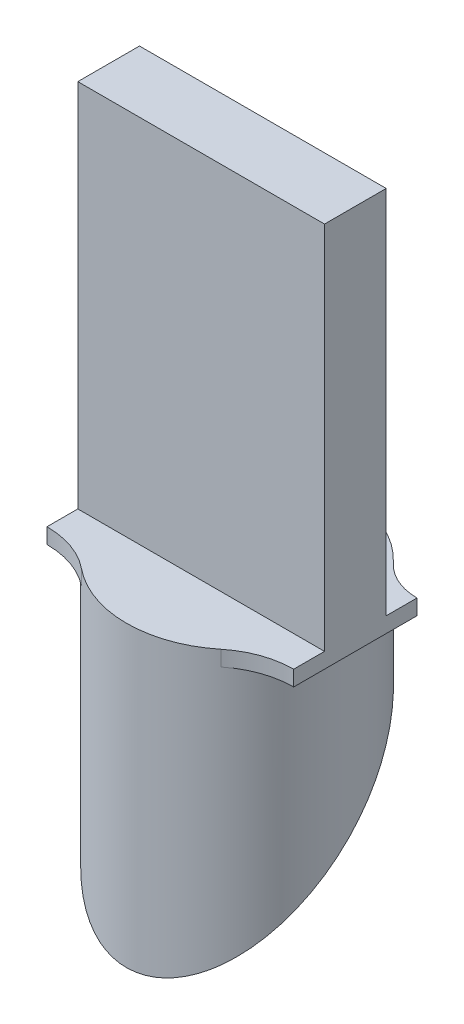
ISO-10303-21;
HEADER;
FILE_DESCRIPTION(('STEP AP214'),'2;1');
FILE_NAME('part.step','',(''),(''),'','','');
FILE_SCHEMA(('AUTOMOTIVE_DESIGN { 1 0 10303 214 1 1 1 1 }'));
ENDSEC;
DATA;
#1=APPLICATION_CONTEXT('core data for automotive mechanical design processes');
#2=APPLICATION_PROTOCOL_DEFINITION('international standard','automotive_design',2000,#1);
#3=PRODUCT_CONTEXT('',#1,'mechanical');
#4=PRODUCT('Part','Part','',(#3));
#5=PRODUCT_RELATED_PRODUCT_CATEGORY('part','',(#4));
#6=PRODUCT_DEFINITION_FORMATION('','',#4);
#7=PRODUCT_DEFINITION_CONTEXT('part definition',#1,'design');
#8=PRODUCT_DEFINITION('design','',#6,#7);
#9=PRODUCT_DEFINITION_SHAPE('','',#8);
#10=(LENGTH_UNIT() NAMED_UNIT(*) SI_UNIT(.MILLI.,.METRE.));
#11=(NAMED_UNIT(*) PLANE_ANGLE_UNIT() SI_UNIT($,.RADIAN.));
#12=(NAMED_UNIT(*) SI_UNIT($,.STERADIAN.) SOLID_ANGLE_UNIT());
#13=UNCERTAINTY_MEASURE_WITH_UNIT(LENGTH_MEASURE(1.E-05),#10,'distance_accuracy_value','');
#14=(GEOMETRIC_REPRESENTATION_CONTEXT(3) GLOBAL_UNCERTAINTY_ASSIGNED_CONTEXT((#13)) GLOBAL_UNIT_ASSIGNED_CONTEXT((#10,
#11,#12)) REPRESENTATION_CONTEXT('',''));
#15=CARTESIAN_POINT('',(0.,0.,0.));
#16=DIRECTION('',(0.,0.,1.));
#17=DIRECTION('',(1.,0.,0.));
#18=AXIS2_PLACEMENT_3D('',#15,#16,#17);
#19=CARTESIAN_POINT('',(-25.4,1055.89605122421,30.174126034576));
#20=DIRECTION('',(0.,-1.,0.));
#21=DIRECTION('',(0.,0.,-1.));
#22=AXIS2_PLACEMENT_3D('',#19,#20,#21);
#23=PLANE('',#22);
#24=DIRECTION('',(-1.,0.,0.));
#25=VECTOR('',#24,1.);
#26=CARTESIAN_POINT('',(25.4,1055.89605122421,-6.35));
#27=LINE('',#26,#25);
#28=CARTESIAN_POINT('',(25.4,1055.89605122421,-6.35));
#29=VERTEX_POINT('',#28);
#30=CARTESIAN_POINT('',(-25.4,1055.89605122421,-6.35));
#31=VERTEX_POINT('',#30);
#32=EDGE_CURVE('E142',#29,#31,#27,.T.);
#33=ORIENTED_EDGE('',*,*,#32,.F.);
#34=DIRECTION('',(0.,0.,-1.));
#35=VECTOR('',#34,1.);
#36=CARTESIAN_POINT('',(25.4,1055.89605122421,-12.7));
#37=LINE('',#36,#35);
#38=CARTESIAN_POINT('',(25.4,1055.89605122421,-12.7));
#39=VERTEX_POINT('',#38);
#40=EDGE_CURVE('E164',#29,#39,#37,.T.);
#41=ORIENTED_EDGE('',*,*,#40,.T.);
#42=CARTESIAN_POINT('',(25.4,1055.89605122421,-24.5179424418149));
#43=DIRECTION('',(0.,-1.,0.));
#44=DIRECTION('',(0.,0.,1.));
#45=AXIS2_PLACEMENT_3D('',#42,#43,#44);
#46=CIRCLE('',#45,11.8179424418149);
#47=CARTESIAN_POINT('',(16.7213120057109,1055.89605122421,-16.4964626372008));
#48=VERTEX_POINT('',#47);
#49=EDGE_CURVE('E167',#39,#48,#46,.T.);
#50=ORIENTED_EDGE('',*,*,#49,.T.);
#51=CARTESIAN_POINT('',(0.,1055.89605122421,-1.04140000000008));
#52=DIRECTION('',(0.,1.,0.));
#53=DIRECTION('',(0.,0.,1.));
#54=AXIS2_PLACEMENT_3D('',#51,#52,#53);
#55=CIRCLE('',#54,22.7697438789313);
#56=CARTESIAN_POINT('',(-16.7213120057109,1055.89605122421,-16.4964626372008));
#57=VERTEX_POINT('',#56);
#58=EDGE_CURVE('E169',#48,#57,#55,.T.);
#59=ORIENTED_EDGE('',*,*,#58,.T.);
#60=CARTESIAN_POINT('',(-25.4,1055.89605122421,-24.5179424418149));
#61=DIRECTION('',(0.,-1.,0.));
#62=DIRECTION('',(0.,0.,1.));
#63=AXIS2_PLACEMENT_3D('',#60,#61,#62);
#64=CIRCLE('',#63,11.8179424418149);
#65=CARTESIAN_POINT('',(-25.4,1055.89605122421,-12.7));
#66=VERTEX_POINT('',#65);
#67=EDGE_CURVE('E171',#57,#66,#64,.T.);
#68=ORIENTED_EDGE('',*,*,#67,.T.);
#69=DIRECTION('',(0.,0.,1.));
#70=VECTOR('',#69,1.);
#71=CARTESIAN_POINT('',(-25.4,1055.89605122421,-12.7));
#72=LINE('',#71,#70);
#73=EDGE_CURVE('E58',#66,#31,#72,.T.);
#74=ORIENTED_EDGE('',*,*,#73,.T.);
#75=EDGE_LOOP('',(#33,#41,#50,#59,#68,#74));
#76=FACE_BOUND('',#75,.T.);
#77=ADVANCED_FACE('F35',(#76),#23,.F.);
#78=DIRECTION('',(1.,0.,0.));
#79=VECTOR('',#78,1.);
#80=CARTESIAN_POINT('',(25.4,1055.89605122421,6.35));
#81=LINE('',#80,#79);
#82=CARTESIAN_POINT('',(-25.4,1055.89605122421,6.35));
#83=VERTEX_POINT('',#82);
#84=CARTESIAN_POINT('',(25.4,1055.89605122421,6.35));
#85=VERTEX_POINT('',#84);
#86=EDGE_CURVE('E50',#83,#85,#81,.T.);
#87=ORIENTED_EDGE('',*,*,#86,.F.);
#88=CARTESIAN_POINT('',(-25.4,1055.89605122421,12.7));
#89=VERTEX_POINT('',#88);
#90=EDGE_CURVE('E146',#83,#89,#72,.T.);
#91=ORIENTED_EDGE('',*,*,#90,.T.);
#92=CARTESIAN_POINT('',(-25.4,1055.89605122421,30.174126034576));
#93=DIRECTION('',(0.,-1.,0.));
#94=DIRECTION('',(0.,0.,-1.));
#95=AXIS2_PLACEMENT_3D('',#92,#93,#94);
#96=CIRCLE('',#95,17.474126034576);
#97=CARTESIAN_POINT('',(-14.3711699637201,1055.89605122421,16.6201602421189));
#98=VERTEX_POINT('',#97);
#99=EDGE_CURVE('E156',#89,#98,#96,.T.);
#100=ORIENTED_EDGE('',*,*,#99,.T.);
#101=CARTESIAN_POINT('',(0.,1055.89605122421,-1.04140000000008));
#102=DIRECTION('',(0.,1.,0.));
#103=DIRECTION('',(0.,0.,1.));
#104=AXIS2_PLACEMENT_3D('',#101,#102,#103);
#105=CIRCLE('',#104,22.7697438789313);
#106=CARTESIAN_POINT('',(14.3711699637201,1055.89605122421,16.6201602421189));
#107=VERTEX_POINT('',#106);
#108=EDGE_CURVE('E159',#98,#107,#105,.T.);
#109=ORIENTED_EDGE('',*,*,#108,.T.);
#110=CARTESIAN_POINT('',(25.4,1055.89605122421,30.174126034576));
#111=DIRECTION('',(0.,-1.,0.));
#112=DIRECTION('',(0.,0.,1.));
#113=AXIS2_PLACEMENT_3D('',#110,#111,#112);
#114=CIRCLE('',#113,17.474126034576);
#115=CARTESIAN_POINT('',(25.4,1055.89605122421,12.7));
#116=VERTEX_POINT('',#115);
#117=EDGE_CURVE('E162',#107,#116,#114,.T.);
#118=ORIENTED_EDGE('',*,*,#117,.T.);
#119=EDGE_CURVE('E165',#116,#85,#37,.T.);
#120=ORIENTED_EDGE('',*,*,#119,.T.);
#121=EDGE_LOOP('',(#87,#91,#100,#109,#118,#120));
#122=FACE_BOUND('',#121,.T.);
#123=ADVANCED_FACE('F249',(#122),#23,.F.);
#124=CARTESIAN_POINT('',(0.,1052.72105122421,-1.04140000000008));
#125=DIRECTION('',(0.,1.,0.));
#126=DIRECTION('',(0.,0.,1.));
#127=AXIS2_PLACEMENT_3D('',#124,#125,#126);
#128=CYLINDRICAL_SURFACE('',#127,22.7697438789313);
#129=CARTESIAN_POINT('',(0.,1017.25130734528,-1.04140000000008));
#130=DIRECTION('',(0.,0.707106781186554,0.707106781186541));
#131=DIRECTION('',(0.,0.707106781186541,-0.707106781186554));
#132=AXIS2_PLACEMENT_3D('',#129,#130,#131);
#133=ELLIPSE('',#132,32.2012806053461,22.7697438789313);
#134=CARTESIAN_POINT('',(0.,1040.02105122421,-23.8111438789314));
#135=VERTEX_POINT('',#134);
#136=EDGE_CURVE('E211',#135,#135,#133,.F.);
#137=ORIENTED_EDGE('',*,*,#136,.F.);
#138=EDGE_LOOP('',(#137));
#139=FACE_BOUND('',#138,.T.);
#140=CARTESIAN_POINT('',(0.,1052.72105122421,-1.04140000000008));
#141=DIRECTION('',(0.,1.,0.));
#142=DIRECTION('',(0.,0.,1.));
#143=AXIS2_PLACEMENT_3D('',#140,#141,#142);
#144=CIRCLE('',#143,22.7697438789313);
#145=CARTESIAN_POINT('',(14.3711699637201,1052.72105122421,16.6201602421189));
#146=VERTEX_POINT('',#145);
#147=CARTESIAN_POINT('',(16.7213120057109,1052.72105122421,-16.4964626372008));
#148=VERTEX_POINT('',#147);
#149=EDGE_CURVE('E11',#146,#148,#144,.T.);
#150=ORIENTED_EDGE('',*,*,#149,.F.);
#151=DIRECTION('',(0.,-1.,0.));
#152=VECTOR('',#151,1.);
#153=CARTESIAN_POINT('',(14.3711699637201,1055.89605122421,16.6201602421189));
#154=LINE('',#153,#152);
#155=EDGE_CURVE('E201',#107,#146,#154,.T.);
#156=ORIENTED_EDGE('',*,*,#155,.F.);
#157=ORIENTED_EDGE('',*,*,#108,.F.);
#158=DIRECTION('',(0.,-1.,0.));
#159=VECTOR('',#158,1.);
#160=CARTESIAN_POINT('',(-14.3711699637201,1055.89605122421,16.6201602421189));
#161=LINE('',#160,#159);
#162=CARTESIAN_POINT('',(-14.3711699637201,1052.72105122421,16.6201602421189));
#163=VERTEX_POINT('',#162);
#164=EDGE_CURVE('E204',#98,#163,#161,.T.);
#165=ORIENTED_EDGE('',*,*,#164,.T.);
#166=CARTESIAN_POINT('',(-16.7213120057109,1052.72105122421,-16.4964626372008));
#167=VERTEX_POINT('',#166);
#168=EDGE_CURVE('E43',#167,#163,#144,.T.);
#169=ORIENTED_EDGE('',*,*,#168,.F.);
#170=DIRECTION('',(0.,-1.,0.));
#171=VECTOR('',#170,1.);
#172=CARTESIAN_POINT('',(-16.7213120057109,1055.89605122421,-16.4964626372008));
#173=LINE('',#172,#171);
#174=EDGE_CURVE('E189',#57,#167,#173,.T.);
#175=ORIENTED_EDGE('',*,*,#174,.F.);
#176=ORIENTED_EDGE('',*,*,#58,.F.);
#177=DIRECTION('',(0.,-1.,0.));
#178=VECTOR('',#177,1.);
#179=CARTESIAN_POINT('',(16.7213120057109,1055.89605122421,-16.4964626372008));
#180=LINE('',#179,#178);
#181=EDGE_CURVE('E192',#48,#148,#180,.T.);
#182=ORIENTED_EDGE('',*,*,#181,.T.);
#183=EDGE_LOOP('',(#150,#156,#157,#165,#169,#175,#176,#182));
#184=FACE_BOUND('',#183,.T.);
#185=ADVANCED_FACE('F37',(#139,#184),#128,.T.);
#186=CARTESIAN_POINT('',(-22.7697438789313,994.481563466352,21.7283438789312));
#187=DIRECTION('',(0.,0.707106781186554,0.707106781186541));
#188=DIRECTION('',(0.,-0.707106781186541,0.707106781186554));
#189=AXIS2_PLACEMENT_3D('',#186,#187,#188);
#190=PLANE('',#189);
#191=CARTESIAN_POINT('',(0.,1017.25130734528,-1.04140000000008));
#192=DIRECTION('',(0.,0.707106781186554,0.707106781186541));
#193=DIRECTION('',(0.,0.707106781186541,-0.707106781186554));
#194=AXIS2_PLACEMENT_3D('',#191,#192,#193);
#195=ELLIPSE('',#194,27.7111525448116,19.5947438789313);
#196=CARTESIAN_POINT('',(0.,1036.84605122421,-20.6361438789314));
#197=VERTEX_POINT('',#196);
#198=EDGE_CURVE('E207',#197,#197,#195,.F.);
#199=ORIENTED_EDGE('',*,*,#198,.F.);
#200=EDGE_LOOP('',(#199));
#201=FACE_BOUND('',#200,.T.);
#202=ORIENTED_EDGE('',*,*,#136,.T.);
#203=EDGE_LOOP('',(#202));
#204=FACE_BOUND('',#203,.T.);
#205=ADVANCED_FACE('F294',(#201,#204),#190,.F.);
#206=CARTESIAN_POINT('',(0.,1049.54605122421,-1.04140000000008));
#207=DIRECTION('',(0.,1.,0.));
#208=DIRECTION('',(0.,0.,1.));
#209=AXIS2_PLACEMENT_3D('',#206,#207,#208);
#210=PLANE('',#209);
#211=CARTESIAN_POINT('',(0.,1049.54605122421,-1.04140000000008));
#212=DIRECTION('',(0.,1.,0.));
#213=DIRECTION('',(0.,0.,1.));
#214=AXIS2_PLACEMENT_3D('',#211,#212,#213);
#215=CIRCLE('',#214,19.5947438789313);
#216=CARTESIAN_POINT('',(0.,1049.54605122421,18.5533438789312));
#217=VERTEX_POINT('',#216);
#218=EDGE_CURVE('E208',#217,#217,#215,.T.);
#219=ORIENTED_EDGE('',*,*,#218,.F.);
#220=EDGE_LOOP('',(#219));
#221=FACE_BOUND('',#220,.T.);
#222=ADVANCED_FACE('F291',(#221),#210,.F.);
#223=CARTESIAN_POINT('',(0.,1052.72105122421,-1.04140000000008));
#224=DIRECTION('',(0.,1.,0.));
#225=DIRECTION('',(0.,0.,1.));
#226=AXIS2_PLACEMENT_3D('',#223,#224,#225);
#227=CYLINDRICAL_SURFACE('',#226,19.5947438789313);
#228=ORIENTED_EDGE('',*,*,#198,.T.);
#229=EDGE_LOOP('',(#228));
#230=FACE_BOUND('',#229,.T.);
#231=ORIENTED_EDGE('',*,*,#218,.T.);
#232=EDGE_LOOP('',(#231));
#233=FACE_BOUND('',#232,.T.);
#234=ADVANCED_FACE('F278',(#230,#233),#227,.F.);
#235=CARTESIAN_POINT('',(-25.4,1052.72105122421,30.174126034576));
#236=DIRECTION('',(0.,-1.,0.));
#237=DIRECTION('',(0.,0.,-1.));
#238=AXIS2_PLACEMENT_3D('',#235,#236,#237);
#239=PLANE('',#238);
#240=CARTESIAN_POINT('',(25.4,1052.72105122421,30.174126034576));
#241=DIRECTION('',(0.,-1.,0.));
#242=DIRECTION('',(0.,0.,1.));
#243=AXIS2_PLACEMENT_3D('',#240,#241,#242);
#244=CIRCLE('',#243,17.474126034576);
#245=CARTESIAN_POINT('',(25.4,1052.72105122421,12.7));
#246=VERTEX_POINT('',#245);
#247=EDGE_CURVE('E150',#146,#246,#244,.T.);
#248=ORIENTED_EDGE('',*,*,#247,.F.);
#249=ORIENTED_EDGE('',*,*,#149,.T.);
#250=CARTESIAN_POINT('',(25.4,1052.72105122421,-24.5179424418149));
#251=DIRECTION('',(0.,-1.,0.));
#252=DIRECTION('',(0.,0.,1.));
#253=AXIS2_PLACEMENT_3D('',#250,#251,#252);
#254=CIRCLE('',#253,11.8179424418149);
#255=CARTESIAN_POINT('',(25.4,1052.72105122421,-12.7));
#256=VERTEX_POINT('',#255);
#257=EDGE_CURVE('E178',#256,#148,#254,.T.);
#258=ORIENTED_EDGE('',*,*,#257,.F.);
#259=DIRECTION('',(0.,0.,-1.));
#260=VECTOR('',#259,1.);
#261=CARTESIAN_POINT('',(25.4,1052.72105122421,-12.7));
#262=LINE('',#261,#260);
#263=EDGE_CURVE('E176',#246,#256,#262,.T.);
#264=ORIENTED_EDGE('',*,*,#263,.F.);
#265=EDGE_LOOP('',(#248,#249,#258,#264));
#266=FACE_BOUND('',#265,.T.);
#267=ADVANCED_FACE('F243',(#266),#239,.T.);
#268=CARTESIAN_POINT('',(-25.4,1052.72105122421,-24.5179424418149));
#269=DIRECTION('',(0.,-1.,0.));
#270=DIRECTION('',(0.,0.,1.));
#271=AXIS2_PLACEMENT_3D('',#268,#269,#270);
#272=CIRCLE('',#271,11.8179424418149);
#273=CARTESIAN_POINT('',(-25.4,1052.72105122421,-12.7));
#274=VERTEX_POINT('',#273);
#275=EDGE_CURVE('E181',#167,#274,#272,.T.);
#276=ORIENTED_EDGE('',*,*,#275,.F.);
#277=ORIENTED_EDGE('',*,*,#168,.T.);
#278=CARTESIAN_POINT('',(-25.4,1052.72105122421,30.174126034576));
#279=DIRECTION('',(0.,-1.,0.));
#280=DIRECTION('',(0.,0.,-1.));
#281=AXIS2_PLACEMENT_3D('',#278,#279,#280);
#282=CIRCLE('',#281,17.474126034576);
#283=CARTESIAN_POINT('',(-25.4,1052.72105122421,12.7));
#284=VERTEX_POINT('',#283);
#285=EDGE_CURVE('E147',#284,#163,#282,.T.);
#286=ORIENTED_EDGE('',*,*,#285,.F.);
#287=DIRECTION('',(0.,0.,1.));
#288=VECTOR('',#287,1.);
#289=CARTESIAN_POINT('',(-25.4,1052.72105122421,-12.7));
#290=LINE('',#289,#288);
#291=EDGE_CURVE('E160',#274,#284,#290,.T.);
#292=ORIENTED_EDGE('',*,*,#291,.F.);
#293=EDGE_LOOP('',(#276,#277,#286,#292));
#294=FACE_BOUND('',#293,.T.);
#295=ADVANCED_FACE('F219',(#294),#239,.T.);
#296=CARTESIAN_POINT('',(-25.4,1055.89605122421,30.174126034576));
#297=DIRECTION('',(0.,-1.,0.));
#298=DIRECTION('',(0.,0.,-1.));
#299=AXIS2_PLACEMENT_3D('',#296,#297,#298);
#300=CYLINDRICAL_SURFACE('',#299,17.474126034576);
#301=ORIENTED_EDGE('',*,*,#285,.T.);
#302=ORIENTED_EDGE('',*,*,#164,.F.);
#303=ORIENTED_EDGE('',*,*,#99,.F.);
#304=DIRECTION('',(0.,-1.,0.));
#305=VECTOR('',#304,1.);
#306=CARTESIAN_POINT('',(-25.4,1055.89605122421,12.7));
#307=LINE('',#306,#305);
#308=EDGE_CURVE('E173',#89,#284,#307,.T.);
#309=ORIENTED_EDGE('',*,*,#308,.T.);
#310=EDGE_LOOP('',(#301,#302,#303,#309));
#311=FACE_BOUND('',#310,.T.);
#312=ADVANCED_FACE('F227',(#311),#300,.F.);
#313=CARTESIAN_POINT('',(25.4,1055.89605122421,30.174126034576));
#314=DIRECTION('',(0.,-1.,0.));
#315=DIRECTION('',(0.,0.,-1.));
#316=AXIS2_PLACEMENT_3D('',#313,#314,#315);
#317=CYLINDRICAL_SURFACE('',#316,17.474126034576);
#318=ORIENTED_EDGE('',*,*,#247,.T.);
#319=DIRECTION('',(0.,-1.,0.));
#320=VECTOR('',#319,1.);
#321=CARTESIAN_POINT('',(25.4,1055.89605122421,12.7));
#322=LINE('',#321,#320);
#323=EDGE_CURVE('E198',#116,#246,#322,.T.);
#324=ORIENTED_EDGE('',*,*,#323,.F.);
#325=ORIENTED_EDGE('',*,*,#117,.F.);
#326=ORIENTED_EDGE('',*,*,#155,.T.);
#327=EDGE_LOOP('',(#318,#324,#325,#326));
#328=FACE_BOUND('',#327,.T.);
#329=ADVANCED_FACE('F246',(#328),#317,.F.);
#330=CARTESIAN_POINT('',(25.4,1055.89605122421,-12.7));
#331=DIRECTION('',(-1.,0.,0.));
#332=DIRECTION('',(0.,0.,1.));
#333=AXIS2_PLACEMENT_3D('',#330,#331,#332);
#334=PLANE('',#333);
#335=ORIENTED_EDGE('',*,*,#263,.T.);
#336=DIRECTION('',(0.,-1.,0.));
#337=VECTOR('',#336,1.);
#338=CARTESIAN_POINT('',(25.4,1055.89605122421,-12.7));
#339=LINE('',#338,#337);
#340=EDGE_CURVE('E195',#39,#256,#339,.T.);
#341=ORIENTED_EDGE('',*,*,#340,.F.);
#342=ORIENTED_EDGE('',*,*,#40,.F.);
#343=DIRECTION('',(0.,-1.,0.));
#344=VECTOR('',#343,1.);
#345=CARTESIAN_POINT('',(25.4,1132.09605122421,-6.35));
#346=LINE('',#345,#344);
#347=CARTESIAN_POINT('',(25.4,1132.09605122421,-6.35));
#348=VERTEX_POINT('',#347);
#349=EDGE_CURVE('E152',#348,#29,#346,.T.);
#350=ORIENTED_EDGE('',*,*,#349,.F.);
#351=DIRECTION('',(0.,0.,-1.));
#352=VECTOR('',#351,1.);
#353=CARTESIAN_POINT('',(25.4,1132.09605122421,-6.35));
#354=LINE('',#353,#352);
#355=CARTESIAN_POINT('',(25.4,1132.09605122421,6.35));
#356=VERTEX_POINT('',#355);
#357=EDGE_CURVE('E132',#356,#348,#354,.T.);
#358=ORIENTED_EDGE('',*,*,#357,.F.);
#359=DIRECTION('',(0.,-1.,0.));
#360=VECTOR('',#359,1.);
#361=CARTESIAN_POINT('',(25.4,1132.09605122421,6.35));
#362=LINE('',#361,#360);
#363=EDGE_CURVE('E129',#356,#85,#362,.T.);
#364=ORIENTED_EDGE('',*,*,#363,.T.);
#365=ORIENTED_EDGE('',*,*,#119,.F.);
#366=ORIENTED_EDGE('',*,*,#323,.T.);
#367=EDGE_LOOP('',(#335,#341,#342,#350,#358,#364,#365,#366));
#368=FACE_BOUND('',#367,.T.);
#369=ADVANCED_FACE('F252',(#368),#334,.F.);
#370=CARTESIAN_POINT('',(25.4,1055.89605122421,-24.5179424418149));
#371=DIRECTION('',(0.,-1.,0.));
#372=DIRECTION('',(0.,0.,-1.));
#373=AXIS2_PLACEMENT_3D('',#370,#371,#372);
#374=CYLINDRICAL_SURFACE('',#373,11.8179424418149);
#375=ORIENTED_EDGE('',*,*,#257,.T.);
#376=ORIENTED_EDGE('',*,*,#181,.F.);
#377=ORIENTED_EDGE('',*,*,#49,.F.);
#378=ORIENTED_EDGE('',*,*,#340,.T.);
#379=EDGE_LOOP('',(#375,#376,#377,#378));
#380=FACE_BOUND('',#379,.T.);
#381=ADVANCED_FACE('F238',(#380),#374,.F.);
#382=CARTESIAN_POINT('',(-25.4,1055.89605122421,-24.5179424418149));
#383=DIRECTION('',(0.,-1.,0.));
#384=DIRECTION('',(0.,0.,-1.));
#385=AXIS2_PLACEMENT_3D('',#382,#383,#384);
#386=CYLINDRICAL_SURFACE('',#385,11.8179424418149);
#387=ORIENTED_EDGE('',*,*,#275,.T.);
#388=DIRECTION('',(0.,-1.,0.));
#389=VECTOR('',#388,1.);
#390=CARTESIAN_POINT('',(-25.4,1055.89605122421,-12.7));
#391=LINE('',#390,#389);
#392=EDGE_CURVE('E186',#66,#274,#391,.T.);
#393=ORIENTED_EDGE('',*,*,#392,.F.);
#394=ORIENTED_EDGE('',*,*,#67,.F.);
#395=ORIENTED_EDGE('',*,*,#174,.T.);
#396=EDGE_LOOP('',(#387,#393,#394,#395));
#397=FACE_BOUND('',#396,.T.);
#398=ADVANCED_FACE('F231',(#397),#386,.F.);
#399=CARTESIAN_POINT('',(-25.4,1055.89605122421,-12.7));
#400=DIRECTION('',(1.,0.,0.));
#401=DIRECTION('',(0.,0.,-1.));
#402=AXIS2_PLACEMENT_3D('',#399,#400,#401);
#403=PLANE('',#402);
#404=ORIENTED_EDGE('',*,*,#291,.T.);
#405=ORIENTED_EDGE('',*,*,#308,.F.);
#406=ORIENTED_EDGE('',*,*,#90,.F.);
#407=DIRECTION('',(0.,-1.,0.));
#408=VECTOR('',#407,1.);
#409=CARTESIAN_POINT('',(-25.4,1132.09605122421,6.35));
#410=LINE('',#409,#408);
#411=CARTESIAN_POINT('',(-25.4,1132.09605122421,6.35));
#412=VERTEX_POINT('',#411);
#413=EDGE_CURVE('E127',#412,#83,#410,.T.);
#414=ORIENTED_EDGE('',*,*,#413,.F.);
#415=DIRECTION('',(0.,0.,1.));
#416=VECTOR('',#415,1.);
#417=CARTESIAN_POINT('',(-25.4,1132.09605122421,-6.35));
#418=LINE('',#417,#416);
#419=CARTESIAN_POINT('',(-25.4,1132.09605122421,-6.35));
#420=VERTEX_POINT('',#419);
#421=EDGE_CURVE('E133',#420,#412,#418,.T.);
#422=ORIENTED_EDGE('',*,*,#421,.F.);
#423=DIRECTION('',(0.,-1.,0.));
#424=VECTOR('',#423,1.);
#425=CARTESIAN_POINT('',(-25.4,1132.09605122421,-6.35));
#426=LINE('',#425,#424);
#427=EDGE_CURVE('E256',#420,#31,#426,.T.);
#428=ORIENTED_EDGE('',*,*,#427,.T.);
#429=ORIENTED_EDGE('',*,*,#73,.F.);
#430=ORIENTED_EDGE('',*,*,#392,.T.);
#431=EDGE_LOOP('',(#404,#405,#406,#414,#422,#428,#429,#430));
#432=FACE_BOUND('',#431,.T.);
#433=ADVANCED_FACE('F144',(#432),#403,.F.);
#434=CARTESIAN_POINT('',(25.4,1132.09605122421,6.35));
#435=DIRECTION('',(0.,0.,-1.));
#436=DIRECTION('',(-1.,0.,0.));
#437=AXIS2_PLACEMENT_3D('',#434,#435,#436);
#438=PLANE('',#437);
#439=ORIENTED_EDGE('',*,*,#86,.T.);
#440=ORIENTED_EDGE('',*,*,#363,.F.);
#441=DIRECTION('',(1.,0.,0.));
#442=VECTOR('',#441,1.);
#443=CARTESIAN_POINT('',(25.4,1132.09605122421,6.35));
#444=LINE('',#443,#442);
#445=EDGE_CURVE('E123',#412,#356,#444,.T.);
#446=ORIENTED_EDGE('',*,*,#445,.F.);
#447=ORIENTED_EDGE('',*,*,#413,.T.);
#448=EDGE_LOOP('',(#439,#440,#446,#447));
#449=FACE_BOUND('',#448,.T.);
#450=ADVANCED_FACE('F125',(#449),#438,.F.);
#451=CARTESIAN_POINT('',(25.4,1132.09605122421,-6.35));
#452=DIRECTION('',(0.,0.,1.));
#453=DIRECTION('',(1.,0.,0.));
#454=AXIS2_PLACEMENT_3D('',#451,#452,#453);
#455=PLANE('',#454);
#456=ORIENTED_EDGE('',*,*,#32,.T.);
#457=ORIENTED_EDGE('',*,*,#427,.F.);
#458=DIRECTION('',(-1.,0.,0.));
#459=VECTOR('',#458,1.);
#460=CARTESIAN_POINT('',(25.4,1132.09605122421,-6.35));
#461=LINE('',#460,#459);
#462=EDGE_CURVE('E138',#348,#420,#461,.T.);
#463=ORIENTED_EDGE('',*,*,#462,.F.);
#464=ORIENTED_EDGE('',*,*,#349,.T.);
#465=EDGE_LOOP('',(#456,#457,#463,#464));
#466=FACE_BOUND('',#465,.T.);
#467=ADVANCED_FACE('F261',(#466),#455,.F.);
#468=CARTESIAN_POINT('',(0.,1132.09605122421,0.));
#469=DIRECTION('',(0.,-1.,0.));
#470=DIRECTION('',(0.,0.,-1.));
#471=AXIS2_PLACEMENT_3D('',#468,#469,#470);
#472=PLANE('',#471);
#473=ORIENTED_EDGE('',*,*,#421,.T.);
#474=ORIENTED_EDGE('',*,*,#445,.T.);
#475=ORIENTED_EDGE('',*,*,#357,.T.);
#476=ORIENTED_EDGE('',*,*,#462,.T.);
#477=EDGE_LOOP('',(#473,#474,#475,#476));
#478=FACE_BOUND('',#477,.T.);
#479=ADVANCED_FACE('F136',(#478),#472,.F.);
#480=CLOSED_SHELL('',(#77,#123,#185,#205,#222,#234,#267,#295,#312,#329,#369,#381,#398,#433,#450,
#467,#479));
#481=MANIFOLD_SOLID_BREP('B2',#480);
#482=ADVANCED_BREP_SHAPE_REPRESENTATION('',(#18,#481),#14);
#483=SHAPE_DEFINITION_REPRESENTATION(#9,#482);
ENDSEC;
END-ISO-10303-21;
